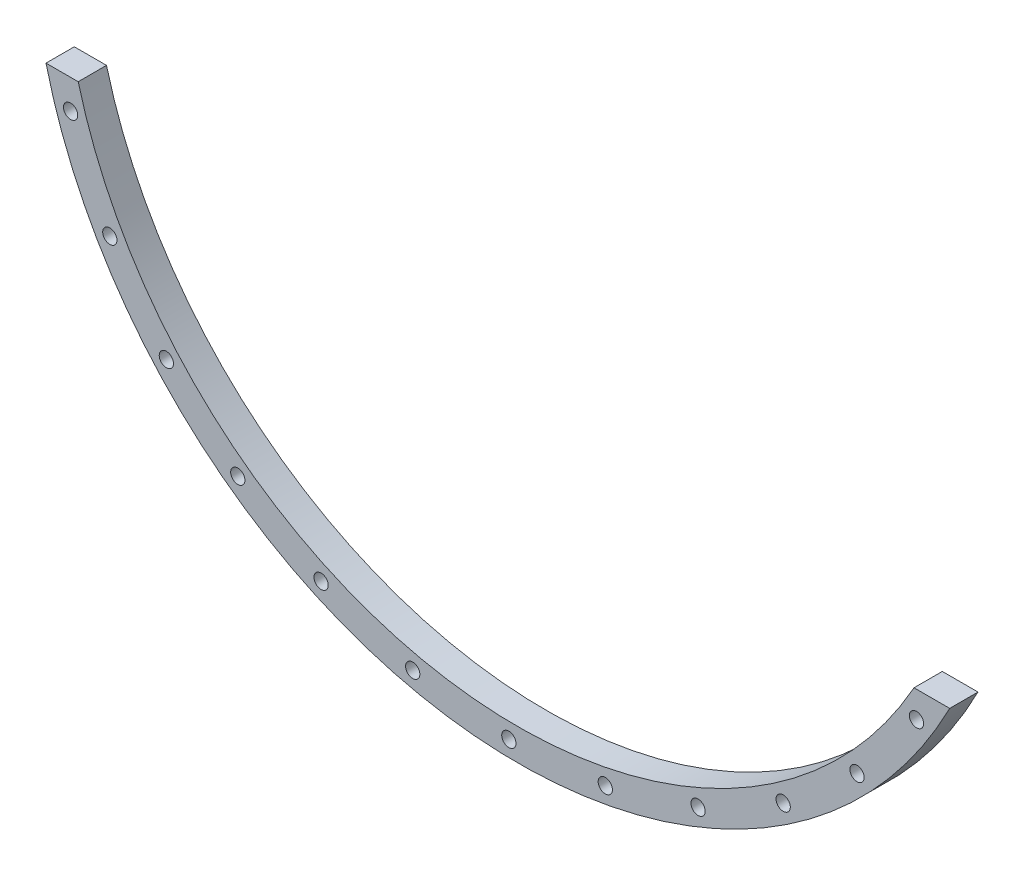
ISO-10303-21;
HEADER;
FILE_DESCRIPTION(('STEP AP214'),'2;1');
FILE_NAME('part.step','',(''),(''),'','','');
FILE_SCHEMA(('AUTOMOTIVE_DESIGN { 1 0 10303 214 1 1 1 1 }'));
ENDSEC;
DATA;
#1=APPLICATION_CONTEXT('core data for automotive mechanical design processes');
#2=APPLICATION_PROTOCOL_DEFINITION('international standard','automotive_design',2000,#1);
#3=PRODUCT_CONTEXT('',#1,'mechanical');
#4=PRODUCT('Part','Part','',(#3));
#5=PRODUCT_RELATED_PRODUCT_CATEGORY('part','',(#4));
#6=PRODUCT_DEFINITION_FORMATION('','',#4);
#7=PRODUCT_DEFINITION_CONTEXT('part definition',#1,'design');
#8=PRODUCT_DEFINITION('design','',#6,#7);
#9=PRODUCT_DEFINITION_SHAPE('','',#8);
#10=(LENGTH_UNIT() NAMED_UNIT(*) SI_UNIT(.MILLI.,.METRE.));
#11=(NAMED_UNIT(*) PLANE_ANGLE_UNIT() SI_UNIT($,.RADIAN.));
#12=(NAMED_UNIT(*) SI_UNIT($,.STERADIAN.) SOLID_ANGLE_UNIT());
#13=UNCERTAINTY_MEASURE_WITH_UNIT(LENGTH_MEASURE(1.E-05),#10,'distance_accuracy_value','');
#14=(GEOMETRIC_REPRESENTATION_CONTEXT(3) GLOBAL_UNCERTAINTY_ASSIGNED_CONTEXT((#13)) GLOBAL_UNIT_ASSIGNED_CONTEXT((#10,
#11,#12)) REPRESENTATION_CONTEXT('',''));
#15=CARTESIAN_POINT('',(0.,0.,0.));
#16=DIRECTION('',(0.,0.,1.));
#17=DIRECTION('',(1.,0.,0.));
#18=AXIS2_PLACEMENT_3D('',#15,#16,#17);
#19=CARTESIAN_POINT('',(0.,0.,3.175));
#20=DIRECTION('',(0.,0.,-1.));
#21=DIRECTION('',(-1.,0.,0.));
#22=AXIS2_PLACEMENT_3D('',#19,#20,#21);
#23=CYLINDRICAL_SURFACE('',#22,102.);
#24=CARTESIAN_POINT('',(0.,0.,-3.175));
#25=DIRECTION('',(0.,0.,-1.));
#26=DIRECTION('',(1.,0.,0.));
#27=AXIS2_PLACEMENT_3D('',#24,#25,#26);
#28=CIRCLE('',#27,102.);
#29=CARTESIAN_POINT('',(88.9044430835714,-49.9999999999999,-3.175));
#30=VERTEX_POINT('',#29);
#31=CARTESIAN_POINT('',(-98.6306240475036,-26.,-3.175));
#32=VERTEX_POINT('',#31);
#33=EDGE_CURVE('E102',#30,#32,#28,.T.);
#34=ORIENTED_EDGE('',*,*,#33,.T.);
#35=DIRECTION('',(0.,0.,-1.));
#36=VECTOR('',#35,1.);
#37=CARTESIAN_POINT('',(-98.6306240475036,-26.,3.175));
#38=LINE('',#37,#36);
#39=CARTESIAN_POINT('',(-98.6306240475036,-26.,3.175));
#40=VERTEX_POINT('',#39);
#41=EDGE_CURVE('E11',#40,#32,#38,.T.);
#42=ORIENTED_EDGE('',*,*,#41,.F.);
#43=CARTESIAN_POINT('',(0.,0.,3.175));
#44=DIRECTION('',(0.,0.,-1.));
#45=DIRECTION('',(1.,0.,0.));
#46=AXIS2_PLACEMENT_3D('',#43,#44,#45);
#47=CIRCLE('',#46,102.);
#48=CARTESIAN_POINT('',(88.9044430835714,-49.9999999999999,3.175));
#49=VERTEX_POINT('',#48);
#50=EDGE_CURVE('E90',#49,#40,#47,.T.);
#51=ORIENTED_EDGE('',*,*,#50,.F.);
#52=DIRECTION('',(0.,0.,-1.));
#53=VECTOR('',#52,1.);
#54=CARTESIAN_POINT('',(88.9044430835714,-49.9999999999999,3.175));
#55=LINE('',#54,#53);
#56=EDGE_CURVE('E98',#49,#30,#55,.T.);
#57=ORIENTED_EDGE('',*,*,#56,.T.);
#58=EDGE_LOOP('',(#34,#42,#51,#57));
#59=FACE_BOUND('',#58,.T.);
#60=ADVANCED_FACE('F39',(#59),#23,.F.);
#61=CARTESIAN_POINT('',(-105.853672586264,-26.,3.175));
#62=DIRECTION('',(0.,-1.,0.));
#63=DIRECTION('',(1.,0.,0.));
#64=AXIS2_PLACEMENT_3D('',#61,#62,#63);
#65=PLANE('',#64);
#66=DIRECTION('',(-1.,0.,0.));
#67=VECTOR('',#66,1.);
#68=CARTESIAN_POINT('',(-105.853672586264,-26.,-3.175));
#69=LINE('',#68,#67);
#70=CARTESIAN_POINT('',(-105.853672586264,-26.,-3.175));
#71=VERTEX_POINT('',#70);
#72=EDGE_CURVE('E94',#32,#71,#69,.T.);
#73=ORIENTED_EDGE('',*,*,#72,.T.);
#74=DIRECTION('',(0.,0.,-1.));
#75=VECTOR('',#74,1.);
#76=CARTESIAN_POINT('',(-105.853672586264,-26.,3.175));
#77=LINE('',#76,#75);
#78=CARTESIAN_POINT('',(-105.853672586264,-26.,3.175));
#79=VERTEX_POINT('',#78);
#80=EDGE_CURVE('E47',#79,#71,#77,.T.);
#81=ORIENTED_EDGE('',*,*,#80,.F.);
#82=DIRECTION('',(-1.,0.,0.));
#83=VECTOR('',#82,1.);
#84=CARTESIAN_POINT('',(-105.853672586264,-26.,3.175));
#85=LINE('',#84,#83);
#86=EDGE_CURVE('E85',#40,#79,#85,.T.);
#87=ORIENTED_EDGE('',*,*,#86,.F.);
#88=ORIENTED_EDGE('',*,*,#41,.T.);
#89=EDGE_LOOP('',(#73,#81,#87,#88));
#90=FACE_BOUND('',#89,.T.);
#91=ADVANCED_FACE('F93',(#90),#65,.F.);
#92=CARTESIAN_POINT('',(0.0181141520764812,-0.0738592761797552,3.175));
#93=DIRECTION('',(0.,0.,-1.));
#94=DIRECTION('',(-1.,0.,0.));
#95=AXIS2_PLACEMENT_3D('',#92,#93,#94);
#96=CYLINDRICAL_SURFACE('',#95,109.);
#97=CARTESIAN_POINT('',(0.0181141520764812,-0.0738592761797552,-3.175));
#98=DIRECTION('',(0.,0.,1.));
#99=DIRECTION('',(1.,0.,0.));
#100=AXIS2_PLACEMENT_3D('',#97,#98,#99);
#101=CIRCLE('',#100,109.);
#102=CARTESIAN_POINT('',(96.9117696328421,-50.,-3.175));
#103=VERTEX_POINT('',#102);
#104=EDGE_CURVE('E72',#71,#103,#101,.T.);
#105=ORIENTED_EDGE('',*,*,#104,.T.);
#106=DIRECTION('',(0.,0.,-1.));
#107=VECTOR('',#106,1.);
#108=CARTESIAN_POINT('',(96.9117696328421,-50.,3.175));
#109=LINE('',#108,#107);
#110=CARTESIAN_POINT('',(96.9117696328421,-50.,3.175));
#111=VERTEX_POINT('',#110);
#112=EDGE_CURVE('E95',#111,#103,#109,.T.);
#113=ORIENTED_EDGE('',*,*,#112,.F.);
#114=CARTESIAN_POINT('',(0.0181141520764812,-0.0738592761797552,3.175));
#115=DIRECTION('',(0.,0.,1.));
#116=DIRECTION('',(1.,0.,0.));
#117=AXIS2_PLACEMENT_3D('',#114,#115,#116);
#118=CIRCLE('',#117,109.);
#119=EDGE_CURVE('E88',#79,#111,#118,.T.);
#120=ORIENTED_EDGE('',*,*,#119,.F.);
#121=ORIENTED_EDGE('',*,*,#80,.T.);
#122=EDGE_LOOP('',(#105,#113,#120,#121));
#123=FACE_BOUND('',#122,.T.);
#124=ADVANCED_FACE('F96',(#123),#96,.T.);
#125=CARTESIAN_POINT('',(88.9044430835714,-49.9999999999999,3.175));
#126=DIRECTION('',(0.,-1.,0.));
#127=DIRECTION('',(1.,0.,0.));
#128=AXIS2_PLACEMENT_3D('',#125,#126,#127);
#129=PLANE('',#128);
#130=DIRECTION('',(-1.,0.,0.));
#131=VECTOR('',#130,1.);
#132=CARTESIAN_POINT('',(88.9044430835714,-49.9999999999999,-3.175));
#133=LINE('',#132,#131);
#134=EDGE_CURVE('E78',#103,#30,#133,.T.);
#135=ORIENTED_EDGE('',*,*,#134,.T.);
#136=ORIENTED_EDGE('',*,*,#56,.F.);
#137=DIRECTION('',(-1.,0.,0.));
#138=VECTOR('',#137,1.);
#139=CARTESIAN_POINT('',(88.9044430835714,-49.9999999999999,3.175));
#140=LINE('',#139,#138);
#141=EDGE_CURVE('E55',#111,#49,#140,.T.);
#142=ORIENTED_EDGE('',*,*,#141,.F.);
#143=ORIENTED_EDGE('',*,*,#112,.T.);
#144=EDGE_LOOP('',(#135,#136,#142,#143));
#145=FACE_BOUND('',#144,.T.);
#146=ADVANCED_FACE('F110',(#145),#129,.F.);
#147=CARTESIAN_POINT('',(0.,0.,3.175));
#148=DIRECTION('',(0.,0.,1.));
#149=DIRECTION('',(1.,0.,0.));
#150=AXIS2_PLACEMENT_3D('',#147,#148,#149);
#151=PLANE('',#150);
#152=CARTESIAN_POINT('',(76.122528254414,-73.0452646798954,3.175));
#153=DIRECTION('',(0.,0.,1.));
#154=DIRECTION('',(1.,0.,0.));
#155=AXIS2_PLACEMENT_3D('',#152,#153,#154);
#156=CIRCLE('',#155,1.60000000000002);
#157=CARTESIAN_POINT('',(77.722528254414,-73.0452646798954,3.175));
#158=VERTEX_POINT('',#157);
#159=EDGE_CURVE('E119',#158,#158,#156,.T.);
#160=ORIENTED_EDGE('',*,*,#159,.F.);
#161=EDGE_LOOP('',(#160));
#162=FACE_BOUND('',#161,.T.);
#163=CARTESIAN_POINT('',(-91.532612734521,-52.4598018104549,3.175));
#164=DIRECTION('',(0.,0.,1.));
#165=DIRECTION('',(1.,0.,0.));
#166=AXIS2_PLACEMENT_3D('',#163,#164,#165);
#167=CIRCLE('',#166,1.59999999999999);
#168=CARTESIAN_POINT('',(-89.932612734521,-52.4598018104549,3.175));
#169=VERTEX_POINT('',#168);
#170=EDGE_CURVE('E125',#169,#169,#167,.T.);
#171=ORIENTED_EDGE('',*,*,#170,.F.);
#172=EDGE_LOOP('',(#171));
#173=FACE_BOUND('',#172,.T.);
#174=CARTESIAN_POINT('',(-62.8210642297584,-84.7570875445858,3.175));
#175=DIRECTION('',(0.,0.,1.));
#176=DIRECTION('',(1.,0.,0.));
#177=AXIS2_PLACEMENT_3D('',#174,#175,#176);
#178=CIRCLE('',#177,1.59999999999999);
#179=CARTESIAN_POINT('',(-61.2210642297584,-84.7570875445858,3.175));
#180=VERTEX_POINT('',#179);
#181=EDGE_CURVE('E156',#180,#180,#178,.T.);
#182=ORIENTED_EDGE('',*,*,#181,.F.);
#183=EDGE_LOOP('',(#182));
#184=FACE_BOUND('',#183,.T.);
#185=CARTESIAN_POINT('',(-44.1305946469869,-95.8266174718869,3.175));
#186=DIRECTION('',(0.,0.,1.));
#187=DIRECTION('',(1.,0.,0.));
#188=AXIS2_PLACEMENT_3D('',#185,#186,#187);
#189=CIRCLE('',#188,1.6);
#190=CARTESIAN_POINT('',(-42.5305946469869,-95.8266174718869,3.175));
#191=VERTEX_POINT('',#190);
#192=EDGE_CURVE('E150',#191,#191,#189,.T.);
#193=ORIENTED_EDGE('',*,*,#192,.F.);
#194=EDGE_LOOP('',(#193));
#195=FACE_BOUND('',#194,.T.);
#196=CARTESIAN_POINT('',(-23.5692037570089,-102.833567643356,3.175));
#197=DIRECTION('',(0.,0.,1.));
#198=DIRECTION('',(1.,0.,0.));
#199=AXIS2_PLACEMENT_3D('',#196,#197,#198);
#200=CIRCLE('',#199,1.6);
#201=CARTESIAN_POINT('',(-21.9692037570089,-102.833567643356,3.175));
#202=VERTEX_POINT('',#201);
#203=EDGE_CURVE('E144',#202,#202,#200,.T.);
#204=ORIENTED_EDGE('',*,*,#203,.F.);
#205=EDGE_LOOP('',(#204));
#206=FACE_BOUND('',#205,.T.);
#207=CARTESIAN_POINT('',(-2.00859393840272,-105.480877652732,3.175));
#208=DIRECTION('',(0.,0.,1.));
#209=DIRECTION('',(1.,0.,0.));
#210=AXIS2_PLACEMENT_3D('',#207,#208,#209);
#211=CIRCLE('',#210,1.60000000000001);
#212=CARTESIAN_POINT('',(-0.408593938402708,-105.480877652732,3.175));
#213=VERTEX_POINT('',#212);
#214=EDGE_CURVE('E138',#213,#213,#211,.T.);
#215=ORIENTED_EDGE('',*,*,#214,.F.);
#216=EDGE_LOOP('',(#215));
#217=FACE_BOUND('',#216,.T.);
#218=CARTESIAN_POINT('',(19.6371704362874,-103.656314507396,3.175));
#219=DIRECTION('',(0.,0.,1.));
#220=DIRECTION('',(1.,0.,0.));
#221=AXIS2_PLACEMENT_3D('',#218,#219,#220);
#222=CIRCLE('',#221,1.60000000000002);
#223=CARTESIAN_POINT('',(21.2371704362874,-103.656314507396,3.175));
#224=VERTEX_POINT('',#223);
#225=EDGE_CURVE('E131',#224,#224,#222,.T.);
#226=ORIENTED_EDGE('',*,*,#225,.F.);
#227=EDGE_LOOP('',(#226));
#228=FACE_BOUND('',#227,.T.);
#229=CARTESIAN_POINT('',(89.4690741445033,-55.9064823766027,3.175));
#230=DIRECTION('',(0.,0.,1.));
#231=DIRECTION('',(1.,0.,0.));
#232=AXIS2_PLACEMENT_3D('',#229,#230,#231);
#233=CIRCLE('',#232,1.60000000000006);
#234=CARTESIAN_POINT('',(91.0690741445033,-55.9064823766027,3.175));
#235=VERTEX_POINT('',#234);
#236=EDGE_CURVE('E105',#235,#235,#233,.T.);
#237=ORIENTED_EDGE('',*,*,#236,.F.);
#238=EDGE_LOOP('',(#237));
#239=FACE_BOUND('',#238,.T.);
#240=CARTESIAN_POINT('',(40.4504148579519,-97.4372307581634,3.175));
#241=DIRECTION('',(0.,0.,1.));
#242=DIRECTION('',(1.,0.,0.));
#243=AXIS2_PLACEMENT_3D('',#240,#241,#242);
#244=CIRCLE('',#243,1.60000000000002);
#245=CARTESIAN_POINT('',(42.050414857952,-97.4372307581634,3.175));
#246=VERTEX_POINT('',#245);
#247=EDGE_CURVE('E132',#246,#246,#244,.T.);
#248=ORIENTED_EDGE('',*,*,#247,.F.);
#249=EDGE_LOOP('',(#248));
#250=FACE_BOUND('',#249,.T.);
#251=CARTESIAN_POINT('',(59.5487595904446,-87.0872851295724,3.175));
#252=DIRECTION('',(0.,0.,1.));
#253=DIRECTION('',(1.,0.,0.));
#254=AXIS2_PLACEMENT_3D('',#251,#252,#253);
#255=CIRCLE('',#254,1.6);
#256=CARTESIAN_POINT('',(61.1487595904446,-87.0872851295724,3.175));
#257=VERTEX_POINT('',#256);
#258=EDGE_CURVE('E179',#257,#257,#255,.T.);
#259=ORIENTED_EDGE('',*,*,#258,.F.);
#260=EDGE_LOOP('',(#259));
#261=FACE_BOUND('',#260,.T.);
#262=CARTESIAN_POINT('',(-78.8482280368196,-70.0942717734745,3.175));
#263=DIRECTION('',(0.,0.,1.));
#264=DIRECTION('',(1.,0.,0.));
#265=AXIS2_PLACEMENT_3D('',#262,#263,#264);
#266=CIRCLE('',#265,1.60000000000002);
#267=CARTESIAN_POINT('',(-77.2482280368196,-70.0942717734745,3.175));
#268=VERTEX_POINT('',#267);
#269=EDGE_CURVE('E173',#268,#268,#266,.T.);
#270=ORIENTED_EDGE('',*,*,#269,.F.);
#271=EDGE_LOOP('',(#270));
#272=FACE_BOUND('',#271,.T.);
#273=CARTESIAN_POINT('',(-100.336462469139,-32.601292906557,3.175));
#274=DIRECTION('',(0.,0.,1.));
#275=DIRECTION('',(1.,0.,0.));
#276=AXIS2_PLACEMENT_3D('',#273,#274,#275);
#277=CIRCLE('',#276,1.60000000000001);
#278=CARTESIAN_POINT('',(-98.7364624691387,-32.601292906557,3.175));
#279=VERTEX_POINT('',#278);
#280=EDGE_CURVE('E167',#279,#279,#277,.T.);
#281=ORIENTED_EDGE('',*,*,#280,.F.);
#282=EDGE_LOOP('',(#281));
#283=FACE_BOUND('',#282,.T.);
#284=ORIENTED_EDGE('',*,*,#50,.T.);
#285=ORIENTED_EDGE('',*,*,#86,.T.);
#286=ORIENTED_EDGE('',*,*,#119,.T.);
#287=ORIENTED_EDGE('',*,*,#141,.T.);
#288=EDGE_LOOP('',(#284,#285,#286,#287));
#289=FACE_BOUND('',#288,.T.);
#290=ADVANCED_FACE('F86',(#162,#173,#184,#195,#206,#217,#228,#239,#250,#261,#272,#283,#289),
#151,.T.);
#291=CARTESIAN_POINT('',(0.,0.,-3.175));
#292=DIRECTION('',(0.,0.,1.));
#293=DIRECTION('',(1.,0.,0.));
#294=AXIS2_PLACEMENT_3D('',#291,#292,#293);
#295=PLANE('',#294);
#296=CARTESIAN_POINT('',(76.122528254414,-73.0452646798954,-3.175));
#297=DIRECTION('',(0.,0.,1.));
#298=DIRECTION('',(1.,0.,0.));
#299=AXIS2_PLACEMENT_3D('',#296,#297,#298);
#300=CIRCLE('',#299,1.60000000000002);
#301=CARTESIAN_POINT('',(77.722528254414,-73.0452646798954,-3.175));
#302=VERTEX_POINT('',#301);
#303=EDGE_CURVE('E122',#302,#302,#300,.T.);
#304=ORIENTED_EDGE('',*,*,#303,.T.);
#305=EDGE_LOOP('',(#304));
#306=FACE_BOUND('',#305,.T.);
#307=CARTESIAN_POINT('',(-91.532612734521,-52.4598018104549,-3.175));
#308=DIRECTION('',(0.,0.,1.));
#309=DIRECTION('',(1.,0.,0.));
#310=AXIS2_PLACEMENT_3D('',#307,#308,#309);
#311=CIRCLE('',#310,1.59999999999999);
#312=CARTESIAN_POINT('',(-89.932612734521,-52.4598018104549,-3.175));
#313=VERTEX_POINT('',#312);
#314=EDGE_CURVE('E159',#313,#313,#311,.T.);
#315=ORIENTED_EDGE('',*,*,#314,.T.);
#316=EDGE_LOOP('',(#315));
#317=FACE_BOUND('',#316,.T.);
#318=CARTESIAN_POINT('',(-62.8210642297584,-84.7570875445858,-3.175));
#319=DIRECTION('',(0.,0.,1.));
#320=DIRECTION('',(1.,0.,0.));
#321=AXIS2_PLACEMENT_3D('',#318,#319,#320);
#322=CIRCLE('',#321,1.59999999999999);
#323=CARTESIAN_POINT('',(-61.2210642297584,-84.7570875445858,-3.175));
#324=VERTEX_POINT('',#323);
#325=EDGE_CURVE('E153',#324,#324,#322,.T.);
#326=ORIENTED_EDGE('',*,*,#325,.T.);
#327=EDGE_LOOP('',(#326));
#328=FACE_BOUND('',#327,.T.);
#329=CARTESIAN_POINT('',(-44.1305946469869,-95.8266174718869,-3.175));
#330=DIRECTION('',(0.,0.,1.));
#331=DIRECTION('',(1.,0.,0.));
#332=AXIS2_PLACEMENT_3D('',#329,#330,#331);
#333=CIRCLE('',#332,1.6);
#334=CARTESIAN_POINT('',(-42.5305946469869,-95.8266174718869,-3.175));
#335=VERTEX_POINT('',#334);
#336=EDGE_CURVE('E147',#335,#335,#333,.T.);
#337=ORIENTED_EDGE('',*,*,#336,.T.);
#338=EDGE_LOOP('',(#337));
#339=FACE_BOUND('',#338,.T.);
#340=CARTESIAN_POINT('',(-23.5692037570089,-102.833567643356,-3.175));
#341=DIRECTION('',(0.,0.,1.));
#342=DIRECTION('',(1.,0.,0.));
#343=AXIS2_PLACEMENT_3D('',#340,#341,#342);
#344=CIRCLE('',#343,1.6);
#345=CARTESIAN_POINT('',(-21.9692037570089,-102.833567643356,-3.175));
#346=VERTEX_POINT('',#345);
#347=EDGE_CURVE('E141',#346,#346,#344,.T.);
#348=ORIENTED_EDGE('',*,*,#347,.T.);
#349=EDGE_LOOP('',(#348));
#350=FACE_BOUND('',#349,.T.);
#351=CARTESIAN_POINT('',(-2.00859393840272,-105.480877652732,-3.175));
#352=DIRECTION('',(0.,0.,1.));
#353=DIRECTION('',(1.,0.,0.));
#354=AXIS2_PLACEMENT_3D('',#351,#352,#353);
#355=CIRCLE('',#354,1.60000000000001);
#356=CARTESIAN_POINT('',(-0.408593938402708,-105.480877652732,-3.175));
#357=VERTEX_POINT('',#356);
#358=EDGE_CURVE('E135',#357,#357,#355,.T.);
#359=ORIENTED_EDGE('',*,*,#358,.T.);
#360=EDGE_LOOP('',(#359));
#361=FACE_BOUND('',#360,.T.);
#362=CARTESIAN_POINT('',(19.6371704362874,-103.656314507396,-3.175));
#363=DIRECTION('',(0.,0.,1.));
#364=DIRECTION('',(1.,0.,0.));
#365=AXIS2_PLACEMENT_3D('',#362,#363,#364);
#366=CIRCLE('',#365,1.60000000000002);
#367=CARTESIAN_POINT('',(21.2371704362874,-103.656314507396,-3.175));
#368=VERTEX_POINT('',#367);
#369=EDGE_CURVE('E128',#368,#368,#366,.T.);
#370=ORIENTED_EDGE('',*,*,#369,.T.);
#371=EDGE_LOOP('',(#370));
#372=FACE_BOUND('',#371,.T.);
#373=CARTESIAN_POINT('',(89.4690741445033,-55.9064823766027,-3.175));
#374=DIRECTION('',(0.,0.,1.));
#375=DIRECTION('',(1.,0.,0.));
#376=AXIS2_PLACEMENT_3D('',#373,#374,#375);
#377=CIRCLE('',#376,1.60000000000006);
#378=CARTESIAN_POINT('',(91.0690741445033,-55.9064823766027,-3.175));
#379=VERTEX_POINT('',#378);
#380=EDGE_CURVE('E116',#379,#379,#377,.T.);
#381=ORIENTED_EDGE('',*,*,#380,.T.);
#382=EDGE_LOOP('',(#381));
#383=FACE_BOUND('',#382,.T.);
#384=CARTESIAN_POINT('',(40.4504148579519,-97.4372307581634,-3.175));
#385=DIRECTION('',(0.,0.,1.));
#386=DIRECTION('',(1.,0.,0.));
#387=AXIS2_PLACEMENT_3D('',#384,#385,#386);
#388=CIRCLE('',#387,1.60000000000002);
#389=CARTESIAN_POINT('',(42.050414857952,-97.4372307581634,-3.175));
#390=VERTEX_POINT('',#389);
#391=EDGE_CURVE('E182',#390,#390,#388,.T.);
#392=ORIENTED_EDGE('',*,*,#391,.T.);
#393=EDGE_LOOP('',(#392));
#394=FACE_BOUND('',#393,.T.);
#395=CARTESIAN_POINT('',(59.5487595904446,-87.0872851295724,-3.175));
#396=DIRECTION('',(0.,0.,1.));
#397=DIRECTION('',(1.,0.,0.));
#398=AXIS2_PLACEMENT_3D('',#395,#396,#397);
#399=CIRCLE('',#398,1.6);
#400=CARTESIAN_POINT('',(61.1487595904446,-87.0872851295724,-3.175));
#401=VERTEX_POINT('',#400);
#402=EDGE_CURVE('E176',#401,#401,#399,.T.);
#403=ORIENTED_EDGE('',*,*,#402,.T.);
#404=EDGE_LOOP('',(#403));
#405=FACE_BOUND('',#404,.T.);
#406=CARTESIAN_POINT('',(-78.8482280368196,-70.0942717734745,-3.175));
#407=DIRECTION('',(0.,0.,1.));
#408=DIRECTION('',(1.,0.,0.));
#409=AXIS2_PLACEMENT_3D('',#406,#407,#408);
#410=CIRCLE('',#409,1.60000000000002);
#411=CARTESIAN_POINT('',(-77.2482280368196,-70.0942717734745,-3.175));
#412=VERTEX_POINT('',#411);
#413=EDGE_CURVE('E170',#412,#412,#410,.T.);
#414=ORIENTED_EDGE('',*,*,#413,.T.);
#415=EDGE_LOOP('',(#414));
#416=FACE_BOUND('',#415,.T.);
#417=CARTESIAN_POINT('',(-100.336462469139,-32.601292906557,-3.175));
#418=DIRECTION('',(0.,0.,1.));
#419=DIRECTION('',(1.,0.,0.));
#420=AXIS2_PLACEMENT_3D('',#417,#418,#419);
#421=CIRCLE('',#420,1.60000000000001);
#422=CARTESIAN_POINT('',(-98.7364624691387,-32.601292906557,-3.175));
#423=VERTEX_POINT('',#422);
#424=EDGE_CURVE('E164',#423,#423,#421,.T.);
#425=ORIENTED_EDGE('',*,*,#424,.T.);
#426=EDGE_LOOP('',(#425));
#427=FACE_BOUND('',#426,.T.);
#428=ORIENTED_EDGE('',*,*,#33,.F.);
#429=ORIENTED_EDGE('',*,*,#134,.F.);
#430=ORIENTED_EDGE('',*,*,#104,.F.);
#431=ORIENTED_EDGE('',*,*,#72,.F.);
#432=EDGE_LOOP('',(#428,#429,#430,#431));
#433=FACE_BOUND('',#432,.T.);
#434=ADVANCED_FACE('F113',(#306,#317,#328,#339,#350,#361,#372,#383,#394,#405,#416,#427,#433),
#295,.F.);
#435=CARTESIAN_POINT('',(-100.336462469139,-32.601292906557,-3.175));
#436=DIRECTION('',(0.,0.,1.));
#437=DIRECTION('',(1.,0.,0.));
#438=AXIS2_PLACEMENT_3D('',#435,#436,#437);
#439=CYLINDRICAL_SURFACE('',#438,1.60000000000001);
#440=ORIENTED_EDGE('',*,*,#424,.F.);
#441=EDGE_LOOP('',(#440));
#442=FACE_BOUND('',#441,.T.);
#443=ORIENTED_EDGE('',*,*,#280,.T.);
#444=EDGE_LOOP('',(#443));
#445=FACE_BOUND('',#444,.T.);
#446=ADVANCED_FACE('F200',(#442,#445),#439,.F.);
#447=CARTESIAN_POINT('',(-78.8482280368196,-70.0942717734745,-3.175));
#448=DIRECTION('',(0.,0.,1.));
#449=DIRECTION('',(1.,0.,0.));
#450=AXIS2_PLACEMENT_3D('',#447,#448,#449);
#451=CYLINDRICAL_SURFACE('',#450,1.60000000000002);
#452=ORIENTED_EDGE('',*,*,#413,.F.);
#453=EDGE_LOOP('',(#452));
#454=FACE_BOUND('',#453,.T.);
#455=ORIENTED_EDGE('',*,*,#269,.T.);
#456=EDGE_LOOP('',(#455));
#457=FACE_BOUND('',#456,.T.);
#458=ADVANCED_FACE('F202',(#454,#457),#451,.F.);
#459=CARTESIAN_POINT('',(59.5487595904446,-87.0872851295724,-3.175));
#460=DIRECTION('',(0.,0.,1.));
#461=DIRECTION('',(1.,0.,0.));
#462=AXIS2_PLACEMENT_3D('',#459,#460,#461);
#463=CYLINDRICAL_SURFACE('',#462,1.6);
#464=ORIENTED_EDGE('',*,*,#402,.F.);
#465=EDGE_LOOP('',(#464));
#466=FACE_BOUND('',#465,.T.);
#467=ORIENTED_EDGE('',*,*,#258,.T.);
#468=EDGE_LOOP('',(#467));
#469=FACE_BOUND('',#468,.T.);
#470=ADVANCED_FACE('F209',(#466,#469),#463,.F.);
#471=CARTESIAN_POINT('',(40.4504148579519,-97.4372307581634,-3.175));
#472=DIRECTION('',(0.,0.,1.));
#473=DIRECTION('',(1.,0.,0.));
#474=AXIS2_PLACEMENT_3D('',#471,#472,#473);
#475=CYLINDRICAL_SURFACE('',#474,1.60000000000002);
#476=ORIENTED_EDGE('',*,*,#391,.F.);
#477=EDGE_LOOP('',(#476));
#478=FACE_BOUND('',#477,.T.);
#479=ORIENTED_EDGE('',*,*,#247,.T.);
#480=EDGE_LOOP('',(#479));
#481=FACE_BOUND('',#480,.T.);
#482=ADVANCED_FACE('F188',(#478,#481),#475,.F.);
#483=CARTESIAN_POINT('',(89.4690741445033,-55.9064823766027,-3.175));
#484=DIRECTION('',(0.,0.,1.));
#485=DIRECTION('',(1.,0.,0.));
#486=AXIS2_PLACEMENT_3D('',#483,#484,#485);
#487=CYLINDRICAL_SURFACE('',#486,1.60000000000006);
#488=ORIENTED_EDGE('',*,*,#380,.F.);
#489=EDGE_LOOP('',(#488));
#490=FACE_BOUND('',#489,.T.);
#491=ORIENTED_EDGE('',*,*,#236,.T.);
#492=EDGE_LOOP('',(#491));
#493=FACE_BOUND('',#492,.T.);
#494=ADVANCED_FACE('F227',(#490,#493),#487,.F.);
#495=CARTESIAN_POINT('',(19.6371704362874,-103.656314507396,-3.175));
#496=DIRECTION('',(0.,0.,1.));
#497=DIRECTION('',(1.,0.,0.));
#498=AXIS2_PLACEMENT_3D('',#495,#496,#497);
#499=CYLINDRICAL_SURFACE('',#498,1.60000000000002);
#500=ORIENTED_EDGE('',*,*,#369,.F.);
#501=EDGE_LOOP('',(#500));
#502=FACE_BOUND('',#501,.T.);
#503=ORIENTED_EDGE('',*,*,#225,.T.);
#504=EDGE_LOOP('',(#503));
#505=FACE_BOUND('',#504,.T.);
#506=ADVANCED_FACE('F230',(#502,#505),#499,.F.);
#507=CARTESIAN_POINT('',(-2.00859393840272,-105.480877652732,-3.175));
#508=DIRECTION('',(0.,0.,1.));
#509=DIRECTION('',(1.,0.,0.));
#510=AXIS2_PLACEMENT_3D('',#507,#508,#509);
#511=CYLINDRICAL_SURFACE('',#510,1.60000000000001);
#512=ORIENTED_EDGE('',*,*,#358,.F.);
#513=EDGE_LOOP('',(#512));
#514=FACE_BOUND('',#513,.T.);
#515=ORIENTED_EDGE('',*,*,#214,.T.);
#516=EDGE_LOOP('',(#515));
#517=FACE_BOUND('',#516,.T.);
#518=ADVANCED_FACE('F239',(#514,#517),#511,.F.);
#519=CARTESIAN_POINT('',(-23.5692037570089,-102.833567643356,-3.175));
#520=DIRECTION('',(0.,0.,1.));
#521=DIRECTION('',(1.,0.,0.));
#522=AXIS2_PLACEMENT_3D('',#519,#520,#521);
#523=CYLINDRICAL_SURFACE('',#522,1.6);
#524=ORIENTED_EDGE('',*,*,#347,.F.);
#525=EDGE_LOOP('',(#524));
#526=FACE_BOUND('',#525,.T.);
#527=ORIENTED_EDGE('',*,*,#203,.T.);
#528=EDGE_LOOP('',(#527));
#529=FACE_BOUND('',#528,.T.);
#530=ADVANCED_FACE('F243',(#526,#529),#523,.F.);
#531=CARTESIAN_POINT('',(-44.1305946469869,-95.8266174718869,-3.175));
#532=DIRECTION('',(0.,0.,1.));
#533=DIRECTION('',(1.,0.,0.));
#534=AXIS2_PLACEMENT_3D('',#531,#532,#533);
#535=CYLINDRICAL_SURFACE('',#534,1.6);
#536=ORIENTED_EDGE('',*,*,#336,.F.);
#537=EDGE_LOOP('',(#536));
#538=FACE_BOUND('',#537,.T.);
#539=ORIENTED_EDGE('',*,*,#192,.T.);
#540=EDGE_LOOP('',(#539));
#541=FACE_BOUND('',#540,.T.);
#542=ADVANCED_FACE('F247',(#538,#541),#535,.F.);
#543=CARTESIAN_POINT('',(-62.8210642297584,-84.7570875445858,-3.175));
#544=DIRECTION('',(0.,0.,1.));
#545=DIRECTION('',(1.,0.,0.));
#546=AXIS2_PLACEMENT_3D('',#543,#544,#545);
#547=CYLINDRICAL_SURFACE('',#546,1.59999999999999);
#548=ORIENTED_EDGE('',*,*,#325,.F.);
#549=EDGE_LOOP('',(#548));
#550=FACE_BOUND('',#549,.T.);
#551=ORIENTED_EDGE('',*,*,#181,.T.);
#552=EDGE_LOOP('',(#551));
#553=FACE_BOUND('',#552,.T.);
#554=ADVANCED_FACE('F251',(#550,#553),#547,.F.);
#555=CARTESIAN_POINT('',(-91.532612734521,-52.4598018104549,-3.175));
#556=DIRECTION('',(0.,0.,1.));
#557=DIRECTION('',(1.,0.,0.));
#558=AXIS2_PLACEMENT_3D('',#555,#556,#557);
#559=CYLINDRICAL_SURFACE('',#558,1.59999999999999);
#560=ORIENTED_EDGE('',*,*,#314,.F.);
#561=EDGE_LOOP('',(#560));
#562=FACE_BOUND('',#561,.T.);
#563=ORIENTED_EDGE('',*,*,#170,.T.);
#564=EDGE_LOOP('',(#563));
#565=FACE_BOUND('',#564,.T.);
#566=ADVANCED_FACE('F235',(#562,#565),#559,.F.);
#567=CARTESIAN_POINT('',(76.122528254414,-73.0452646798954,-3.175));
#568=DIRECTION('',(0.,0.,1.));
#569=DIRECTION('',(1.,0.,0.));
#570=AXIS2_PLACEMENT_3D('',#567,#568,#569);
#571=CYLINDRICAL_SURFACE('',#570,1.60000000000002);
#572=ORIENTED_EDGE('',*,*,#303,.F.);
#573=EDGE_LOOP('',(#572));
#574=FACE_BOUND('',#573,.T.);
#575=ORIENTED_EDGE('',*,*,#159,.T.);
#576=EDGE_LOOP('',(#575));
#577=FACE_BOUND('',#576,.T.);
#578=ADVANCED_FACE('F232',(#574,#577),#571,.F.);
#579=CLOSED_SHELL('',(#60,#91,#124,#146,#290,#434,#446,#458,#470,#482,#494,#506,#518,#530,#542,
#554,#566,#578));
#580=MANIFOLD_SOLID_BREP('B2',#579);
#581=ADVANCED_BREP_SHAPE_REPRESENTATION('',(#18,#580),#14);
#582=SHAPE_DEFINITION_REPRESENTATION(#9,#581);
ENDSEC;
END-ISO-10303-21;
